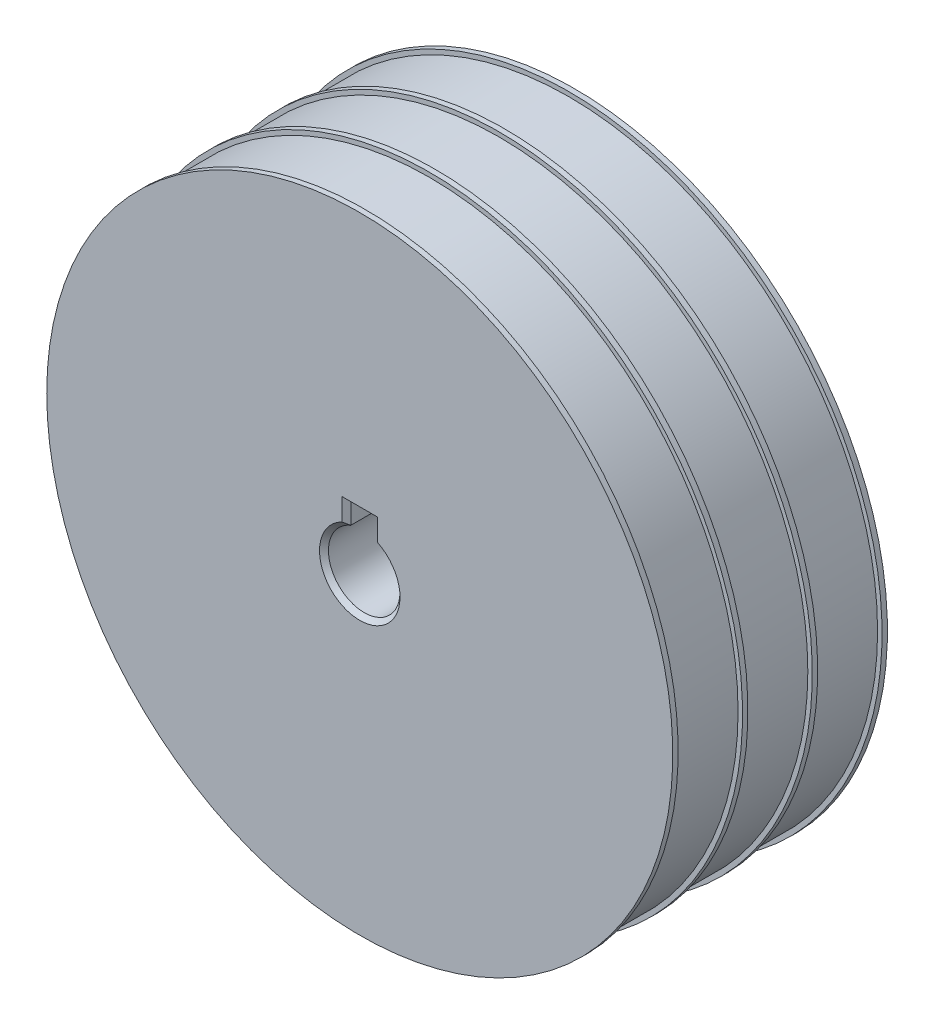
ISO-10303-21;
HEADER;
FILE_DESCRIPTION(('STEP AP214'),'2;1');
FILE_NAME('part.step','',(''),(''),'','','');
FILE_SCHEMA(('AUTOMOTIVE_DESIGN { 1 0 10303 214 1 1 1 1 }'));
ENDSEC;
DATA;
#1=APPLICATION_CONTEXT('core data for automotive mechanical design processes');
#2=APPLICATION_PROTOCOL_DEFINITION('international standard','automotive_design',2000,#1);
#3=PRODUCT_CONTEXT('',#1,'mechanical');
#4=PRODUCT('Part','Part','',(#3));
#5=PRODUCT_RELATED_PRODUCT_CATEGORY('part','',(#4));
#6=PRODUCT_DEFINITION_FORMATION('','',#4);
#7=PRODUCT_DEFINITION_CONTEXT('part definition',#1,'design');
#8=PRODUCT_DEFINITION('design','',#6,#7);
#9=PRODUCT_DEFINITION_SHAPE('','',#8);
#10=(LENGTH_UNIT() NAMED_UNIT(*) SI_UNIT(.MILLI.,.METRE.));
#11=(NAMED_UNIT(*) PLANE_ANGLE_UNIT() SI_UNIT($,.RADIAN.));
#12=(NAMED_UNIT(*) SI_UNIT($,.STERADIAN.) SOLID_ANGLE_UNIT());
#13=UNCERTAINTY_MEASURE_WITH_UNIT(LENGTH_MEASURE(1.E-05),#10,'distance_accuracy_value','');
#14=(GEOMETRIC_REPRESENTATION_CONTEXT(3) GLOBAL_UNCERTAINTY_ASSIGNED_CONTEXT((#13)) GLOBAL_UNIT_ASSIGNED_CONTEXT((#10,
#11,#12)) REPRESENTATION_CONTEXT('',''));
#15=CARTESIAN_POINT('',(0.,0.,0.));
#16=DIRECTION('',(0.,0.,1.));
#17=DIRECTION('',(1.,0.,0.));
#18=AXIS2_PLACEMENT_3D('',#15,#16,#17);
#19=CARTESIAN_POINT('',(0.,0.,-42.5522988505747));
#20=DIRECTION('',(0.,0.,-1.));
#21=DIRECTION('',(-1.,0.,0.));
#22=AXIS2_PLACEMENT_3D('',#19,#20,#21);
#23=CYLINDRICAL_SURFACE('',#22,4.);
#24=DIRECTION('',(0.,0.,-1.));
#25=VECTOR('',#24,1.);
#26=CARTESIAN_POINT('',(-1.5,3.70809924354783,-42.5522988505747));
#27=LINE('',#26,#25);
#28=CARTESIAN_POINT('',(-1.49999999999999,3.70809924354783,-2.39051724137928));
#29=VERTEX_POINT('',#28);
#30=CARTESIAN_POINT('',(-1.5,3.70809924354783,-25.3905172413793));
#31=VERTEX_POINT('',#30);
#32=EDGE_CURVE('E218',#29,#31,#27,.T.);
#33=ORIENTED_EDGE('',*,*,#32,.F.);
#34=CARTESIAN_POINT('',(0.,0.,-2.39051724137928));
#35=DIRECTION('',(0.,0.,1.));
#36=DIRECTION('',(1.,0.,0.));
#37=AXIS2_PLACEMENT_3D('',#34,#35,#36);
#38=CIRCLE('',#37,4.);
#39=CARTESIAN_POINT('',(1.50000000000001,3.70809924354783,-2.39051724137927));
#40=VERTEX_POINT('',#39);
#41=EDGE_CURVE('E108',#29,#40,#38,.T.);
#42=ORIENTED_EDGE('',*,*,#41,.T.);
#43=DIRECTION('',(0.,0.,-1.));
#44=VECTOR('',#43,1.);
#45=CARTESIAN_POINT('',(1.5,3.70809924354783,-42.5522988505747));
#46=LINE('',#45,#44);
#47=CARTESIAN_POINT('',(1.5,3.70809924354783,-25.3905172413793));
#48=VERTEX_POINT('',#47);
#49=EDGE_CURVE('E224',#48,#40,#46,.F.);
#50=ORIENTED_EDGE('',*,*,#49,.F.);
#51=CARTESIAN_POINT('',(0.,0.,-25.3905172413793));
#52=DIRECTION('',(0.,0.,-1.));
#53=DIRECTION('',(-1.,0.,0.));
#54=AXIS2_PLACEMENT_3D('',#51,#52,#53);
#55=CIRCLE('',#54,4.);
#56=EDGE_CURVE('E128',#48,#31,#55,.T.);
#57=ORIENTED_EDGE('',*,*,#56,.T.);
#58=EDGE_LOOP('',(#33,#42,#50,#57));
#59=FACE_BOUND('',#58,.T.);
#60=ADVANCED_FACE('F31',(#59),#23,.F.);
#61=CARTESIAN_POINT('',(-35.,0.,-1.89051724137929));
#62=DIRECTION('',(0.,0.,1.));
#63=DIRECTION('',(1.,0.,0.));
#64=AXIS2_PLACEMENT_3D('',#61,#62,#63);
#65=PLANE('',#64);
#66=DIRECTION('',(0.,-1.,0.));
#67=VECTOR('',#66,1.);
#68=CARTESIAN_POINT('',(2.,3.70809924354783,-1.89051724137929));
#69=LINE('',#68,#67);
#70=CARTESIAN_POINT('',(2.,6.5,-1.89051724137929));
#71=VERTEX_POINT('',#70);
#72=CARTESIAN_POINT('',(2.,4.03112887414939,-1.89051724137929));
#73=VERTEX_POINT('',#72);
#74=EDGE_CURVE('E126',#71,#73,#69,.T.);
#75=ORIENTED_EDGE('',*,*,#74,.T.);
#76=CARTESIAN_POINT('',(0.,0.,-1.89051724137929));
#77=DIRECTION('',(0.,0.,1.));
#78=DIRECTION('',(1.,0.,0.));
#79=AXIS2_PLACEMENT_3D('',#76,#77,#78);
#80=CIRCLE('',#79,4.5);
#81=CARTESIAN_POINT('',(-1.99999999999999,4.03112887414939,-1.89051724137929));
#82=VERTEX_POINT('',#81);
#83=EDGE_CURVE('E106',#73,#82,#80,.F.);
#84=ORIENTED_EDGE('',*,*,#83,.T.);
#85=DIRECTION('',(0.,1.,0.));
#86=VECTOR('',#85,1.);
#87=CARTESIAN_POINT('',(-1.99999999999999,6.,-1.89051724137929));
#88=LINE('',#87,#86);
#89=CARTESIAN_POINT('',(-1.99999999999999,6.5,-1.89051724137929));
#90=VERTEX_POINT('',#89);
#91=EDGE_CURVE('E114',#82,#90,#88,.T.);
#92=ORIENTED_EDGE('',*,*,#91,.T.);
#93=DIRECTION('',(1.,0.,0.));
#94=VECTOR('',#93,1.);
#95=CARTESIAN_POINT('',(1.50000000000001,6.5,-1.89051724137929));
#96=LINE('',#95,#94);
#97=EDGE_CURVE('E120',#90,#71,#96,.T.);
#98=ORIENTED_EDGE('',*,*,#97,.T.);
#99=EDGE_LOOP('',(#75,#84,#92,#98));
#100=FACE_BOUND('',#99,.T.);
#101=CARTESIAN_POINT('',(0.,0.,-1.89051724137929));
#102=DIRECTION('',(0.,0.,-1.));
#103=DIRECTION('',(-1.,0.,0.));
#104=AXIS2_PLACEMENT_3D('',#101,#102,#103);
#105=CIRCLE('',#104,35.);
#106=CARTESIAN_POINT('',(-35.,0.,-1.89051724137929));
#107=VERTEX_POINT('',#106);
#108=EDGE_CURVE('E121',#107,#107,#105,.T.);
#109=ORIENTED_EDGE('',*,*,#108,.F.);
#110=EDGE_LOOP('',(#109));
#111=FACE_BOUND('',#110,.T.);
#112=ADVANCED_FACE('F123',(#100,#111),#65,.T.);
#113=CARTESIAN_POINT('',(0.,0.,-42.5522988505747));
#114=DIRECTION('',(0.,0.,-1.));
#115=DIRECTION('',(-1.,0.,0.));
#116=AXIS2_PLACEMENT_3D('',#113,#114,#115);
#117=CYLINDRICAL_SURFACE('',#116,35.);
#118=ORIENTED_EDGE('',*,*,#108,.T.);
#119=EDGE_LOOP('',(#118));
#120=FACE_BOUND('',#119,.T.);
#121=CARTESIAN_POINT('',(0.,0.,-2.4905172413793));
#122=DIRECTION('',(0.,0.,-1.));
#123=DIRECTION('',(-1.,0.,0.));
#124=AXIS2_PLACEMENT_3D('',#121,#122,#123);
#125=CIRCLE('',#124,35.);
#126=CARTESIAN_POINT('',(-35.,0.,-2.49051724137929));
#127=VERTEX_POINT('',#126);
#128=EDGE_CURVE('E257',#127,#127,#125,.T.);
#129=ORIENTED_EDGE('',*,*,#128,.F.);
#130=EDGE_LOOP('',(#129));
#131=FACE_BOUND('',#130,.T.);
#132=ADVANCED_FACE('F293',(#120,#131),#117,.T.);
#133=CARTESIAN_POINT('',(-34.5,0.,-2.49051724137929));
#134=DIRECTION('',(0.,0.,-1.));
#135=DIRECTION('',(-1.,0.,0.));
#136=AXIS2_PLACEMENT_3D('',#133,#134,#135);
#137=PLANE('',#136);
#138=ORIENTED_EDGE('',*,*,#128,.T.);
#139=EDGE_LOOP('',(#138));
#140=FACE_BOUND('',#139,.T.);
#141=CARTESIAN_POINT('',(0.,0.,-2.4905172413793));
#142=DIRECTION('',(0.,0.,-1.));
#143=DIRECTION('',(-1.,0.,0.));
#144=AXIS2_PLACEMENT_3D('',#141,#142,#143);
#145=CIRCLE('',#144,34.5);
#146=CARTESIAN_POINT('',(-34.5,0.,-2.49051724137929));
#147=VERTEX_POINT('',#146);
#148=EDGE_CURVE('E254',#147,#147,#145,.T.);
#149=ORIENTED_EDGE('',*,*,#148,.F.);
#150=EDGE_LOOP('',(#149));
#151=FACE_BOUND('',#150,.T.);
#152=ADVANCED_FACE('F298',(#140,#151),#137,.T.);
#153=CARTESIAN_POINT('',(0.,0.,-42.5522988505747));
#154=DIRECTION('',(0.,0.,-1.));
#155=DIRECTION('',(-1.,0.,0.));
#156=AXIS2_PLACEMENT_3D('',#153,#154,#155);
#157=CYLINDRICAL_SURFACE('',#156,34.5);
#158=ORIENTED_EDGE('',*,*,#148,.T.);
#159=EDGE_LOOP('',(#158));
#160=FACE_BOUND('',#159,.T.);
#161=CARTESIAN_POINT('',(0.,0.,-9.6905172413793));
#162=DIRECTION('',(0.,0.,-1.));
#163=DIRECTION('',(-1.,0.,0.));
#164=AXIS2_PLACEMENT_3D('',#161,#162,#163);
#165=CIRCLE('',#164,34.5);
#166=CARTESIAN_POINT('',(-34.5,0.,-9.69051724137929));
#167=VERTEX_POINT('',#166);
#168=EDGE_CURVE('E251',#167,#167,#165,.T.);
#169=ORIENTED_EDGE('',*,*,#168,.F.);
#170=EDGE_LOOP('',(#169));
#171=FACE_BOUND('',#170,.T.);
#172=ADVANCED_FACE('F302',(#160,#171),#157,.T.);
#173=CARTESIAN_POINT('',(-35.,0.,-9.69051724137929));
#174=DIRECTION('',(0.,0.,1.));
#175=DIRECTION('',(1.,0.,0.));
#176=AXIS2_PLACEMENT_3D('',#173,#174,#175);
#177=PLANE('',#176);
#178=ORIENTED_EDGE('',*,*,#168,.T.);
#179=EDGE_LOOP('',(#178));
#180=FACE_BOUND('',#179,.T.);
#181=CARTESIAN_POINT('',(0.,0.,-9.6905172413793));
#182=DIRECTION('',(0.,0.,-1.));
#183=DIRECTION('',(-1.,0.,0.));
#184=AXIS2_PLACEMENT_3D('',#181,#182,#183);
#185=CIRCLE('',#184,35.);
#186=CARTESIAN_POINT('',(-35.,0.,-9.69051724137929));
#187=VERTEX_POINT('',#186);
#188=EDGE_CURVE('E248',#187,#187,#185,.T.);
#189=ORIENTED_EDGE('',*,*,#188,.F.);
#190=EDGE_LOOP('',(#189));
#191=FACE_BOUND('',#190,.T.);
#192=ADVANCED_FACE('F306',(#180,#191),#177,.T.);
#193=CARTESIAN_POINT('',(0.,0.,-42.5522988505747));
#194=DIRECTION('',(0.,0.,-1.));
#195=DIRECTION('',(-1.,0.,0.));
#196=AXIS2_PLACEMENT_3D('',#193,#194,#195);
#197=CYLINDRICAL_SURFACE('',#196,35.);
#198=ORIENTED_EDGE('',*,*,#188,.T.);
#199=EDGE_LOOP('',(#198));
#200=FACE_BOUND('',#199,.T.);
#201=CARTESIAN_POINT('',(0.,0.,-10.2905172413793));
#202=DIRECTION('',(0.,0.,-1.));
#203=DIRECTION('',(-1.,0.,0.));
#204=AXIS2_PLACEMENT_3D('',#201,#202,#203);
#205=CIRCLE('',#204,35.);
#206=CARTESIAN_POINT('',(-35.,0.,-10.2905172413793));
#207=VERTEX_POINT('',#206);
#208=EDGE_CURVE('E245',#207,#207,#205,.T.);
#209=ORIENTED_EDGE('',*,*,#208,.F.);
#210=EDGE_LOOP('',(#209));
#211=FACE_BOUND('',#210,.T.);
#212=ADVANCED_FACE('F310',(#200,#211),#197,.T.);
#213=CARTESIAN_POINT('',(-34.5,0.,-10.2905172413793));
#214=DIRECTION('',(0.,0.,-1.));
#215=DIRECTION('',(-1.,0.,0.));
#216=AXIS2_PLACEMENT_3D('',#213,#214,#215);
#217=PLANE('',#216);
#218=ORIENTED_EDGE('',*,*,#208,.T.);
#219=EDGE_LOOP('',(#218));
#220=FACE_BOUND('',#219,.T.);
#221=CARTESIAN_POINT('',(0.,0.,-10.2905172413793));
#222=DIRECTION('',(0.,0.,-1.));
#223=DIRECTION('',(-1.,0.,0.));
#224=AXIS2_PLACEMENT_3D('',#221,#222,#223);
#225=CIRCLE('',#224,34.5);
#226=CARTESIAN_POINT('',(-34.5,0.,-10.2905172413793));
#227=VERTEX_POINT('',#226);
#228=EDGE_CURVE('E242',#227,#227,#225,.T.);
#229=ORIENTED_EDGE('',*,*,#228,.F.);
#230=EDGE_LOOP('',(#229));
#231=FACE_BOUND('',#230,.T.);
#232=ADVANCED_FACE('F314',(#220,#231),#217,.T.);
#233=CARTESIAN_POINT('',(0.,0.,-42.5522988505747));
#234=DIRECTION('',(0.,0.,-1.));
#235=DIRECTION('',(-1.,0.,0.));
#236=AXIS2_PLACEMENT_3D('',#233,#234,#235);
#237=CYLINDRICAL_SURFACE('',#236,34.5);
#238=ORIENTED_EDGE('',*,*,#228,.T.);
#239=EDGE_LOOP('',(#238));
#240=FACE_BOUND('',#239,.T.);
#241=CARTESIAN_POINT('',(0.,0.,-17.4905172413793));
#242=DIRECTION('',(0.,0.,-1.));
#243=DIRECTION('',(-1.,0.,0.));
#244=AXIS2_PLACEMENT_3D('',#241,#242,#243);
#245=CIRCLE('',#244,34.5);
#246=CARTESIAN_POINT('',(-34.5,0.,-17.4905172413793));
#247=VERTEX_POINT('',#246);
#248=EDGE_CURVE('E239',#247,#247,#245,.T.);
#249=ORIENTED_EDGE('',*,*,#248,.F.);
#250=EDGE_LOOP('',(#249));
#251=FACE_BOUND('',#250,.T.);
#252=ADVANCED_FACE('F318',(#240,#251),#237,.T.);
#253=CARTESIAN_POINT('',(-35.,0.,-17.4905172413793));
#254=DIRECTION('',(0.,0.,1.));
#255=DIRECTION('',(1.,0.,0.));
#256=AXIS2_PLACEMENT_3D('',#253,#254,#255);
#257=PLANE('',#256);
#258=ORIENTED_EDGE('',*,*,#248,.T.);
#259=EDGE_LOOP('',(#258));
#260=FACE_BOUND('',#259,.T.);
#261=CARTESIAN_POINT('',(0.,0.,-17.4905172413793));
#262=DIRECTION('',(0.,0.,-1.));
#263=DIRECTION('',(-1.,0.,0.));
#264=AXIS2_PLACEMENT_3D('',#261,#262,#263);
#265=CIRCLE('',#264,35.);
#266=CARTESIAN_POINT('',(-35.,0.,-17.4905172413793));
#267=VERTEX_POINT('',#266);
#268=EDGE_CURVE('E236',#267,#267,#265,.T.);
#269=ORIENTED_EDGE('',*,*,#268,.F.);
#270=EDGE_LOOP('',(#269));
#271=FACE_BOUND('',#270,.T.);
#272=ADVANCED_FACE('F322',(#260,#271),#257,.T.);
#273=CARTESIAN_POINT('',(0.,0.,-42.5522988505747));
#274=DIRECTION('',(0.,0.,-1.));
#275=DIRECTION('',(-1.,0.,0.));
#276=AXIS2_PLACEMENT_3D('',#273,#274,#275);
#277=CYLINDRICAL_SURFACE('',#276,35.);
#278=ORIENTED_EDGE('',*,*,#268,.T.);
#279=EDGE_LOOP('',(#278));
#280=FACE_BOUND('',#279,.T.);
#281=CARTESIAN_POINT('',(0.,0.,-18.0905172413793));
#282=DIRECTION('',(0.,0.,-1.));
#283=DIRECTION('',(-1.,0.,0.));
#284=AXIS2_PLACEMENT_3D('',#281,#282,#283);
#285=CIRCLE('',#284,35.);
#286=CARTESIAN_POINT('',(-35.,0.,-18.0905172413793));
#287=VERTEX_POINT('',#286);
#288=EDGE_CURVE('E233',#287,#287,#285,.T.);
#289=ORIENTED_EDGE('',*,*,#288,.F.);
#290=EDGE_LOOP('',(#289));
#291=FACE_BOUND('',#290,.T.);
#292=ADVANCED_FACE('F326',(#280,#291),#277,.T.);
#293=CARTESIAN_POINT('',(-34.5,0.,-18.0905172413793));
#294=DIRECTION('',(0.,0.,-1.));
#295=DIRECTION('',(-1.,0.,0.));
#296=AXIS2_PLACEMENT_3D('',#293,#294,#295);
#297=PLANE('',#296);
#298=ORIENTED_EDGE('',*,*,#288,.T.);
#299=EDGE_LOOP('',(#298));
#300=FACE_BOUND('',#299,.T.);
#301=CARTESIAN_POINT('',(0.,0.,-18.0905172413793));
#302=DIRECTION('',(0.,0.,-1.));
#303=DIRECTION('',(-1.,0.,0.));
#304=AXIS2_PLACEMENT_3D('',#301,#302,#303);
#305=CIRCLE('',#304,34.5);
#306=CARTESIAN_POINT('',(-34.5,0.,-18.0905172413793));
#307=VERTEX_POINT('',#306);
#308=EDGE_CURVE('E230',#307,#307,#305,.T.);
#309=ORIENTED_EDGE('',*,*,#308,.F.);
#310=EDGE_LOOP('',(#309));
#311=FACE_BOUND('',#310,.T.);
#312=ADVANCED_FACE('F330',(#300,#311),#297,.T.);
#313=CARTESIAN_POINT('',(0.,0.,-42.5522988505747));
#314=DIRECTION('',(0.,0.,-1.));
#315=DIRECTION('',(-1.,0.,0.));
#316=AXIS2_PLACEMENT_3D('',#313,#314,#315);
#317=CYLINDRICAL_SURFACE('',#316,34.5);
#318=ORIENTED_EDGE('',*,*,#308,.T.);
#319=EDGE_LOOP('',(#318));
#320=FACE_BOUND('',#319,.T.);
#321=CARTESIAN_POINT('',(0.,0.,-25.2905172413793));
#322=DIRECTION('',(0.,0.,-1.));
#323=DIRECTION('',(-1.,0.,0.));
#324=AXIS2_PLACEMENT_3D('',#321,#322,#323);
#325=CIRCLE('',#324,34.5);
#326=CARTESIAN_POINT('',(-34.5,0.,-25.2905172413793));
#327=VERTEX_POINT('',#326);
#328=EDGE_CURVE('E221',#327,#327,#325,.T.);
#329=ORIENTED_EDGE('',*,*,#328,.F.);
#330=EDGE_LOOP('',(#329));
#331=FACE_BOUND('',#330,.T.);
#332=ADVANCED_FACE('F334',(#320,#331),#317,.T.);
#333=CARTESIAN_POINT('',(-35.,0.,-25.2905172413793));
#334=DIRECTION('',(0.,0.,1.));
#335=DIRECTION('',(1.,0.,0.));
#336=AXIS2_PLACEMENT_3D('',#333,#334,#335);
#337=PLANE('',#336);
#338=ORIENTED_EDGE('',*,*,#328,.T.);
#339=EDGE_LOOP('',(#338));
#340=FACE_BOUND('',#339,.T.);
#341=CARTESIAN_POINT('',(0.,0.,-25.2905172413793));
#342=DIRECTION('',(0.,0.,-1.));
#343=DIRECTION('',(-1.,0.,0.));
#344=AXIS2_PLACEMENT_3D('',#341,#342,#343);
#345=CIRCLE('',#344,35.);
#346=CARTESIAN_POINT('',(-35.,0.,-25.2905172413793));
#347=VERTEX_POINT('',#346);
#348=EDGE_CURVE('E217',#347,#347,#345,.T.);
#349=ORIENTED_EDGE('',*,*,#348,.F.);
#350=EDGE_LOOP('',(#349));
#351=FACE_BOUND('',#350,.T.);
#352=ADVANCED_FACE('F338',(#340,#351),#337,.T.);
#353=CARTESIAN_POINT('',(0.,0.,-42.5522988505747));
#354=DIRECTION('',(0.,0.,-1.));
#355=DIRECTION('',(-1.,0.,0.));
#356=AXIS2_PLACEMENT_3D('',#353,#354,#355);
#357=CYLINDRICAL_SURFACE('',#356,35.);
#358=ORIENTED_EDGE('',*,*,#348,.T.);
#359=EDGE_LOOP('',(#358));
#360=FACE_BOUND('',#359,.T.);
#361=CARTESIAN_POINT('',(0.,0.,-25.8905172413793));
#362=DIRECTION('',(0.,0.,-1.));
#363=DIRECTION('',(-1.,0.,0.));
#364=AXIS2_PLACEMENT_3D('',#361,#362,#363);
#365=CIRCLE('',#364,35.);
#366=CARTESIAN_POINT('',(-35.,0.,-25.8905172413793));
#367=VERTEX_POINT('',#366);
#368=EDGE_CURVE('E215',#367,#367,#365,.T.);
#369=ORIENTED_EDGE('',*,*,#368,.F.);
#370=EDGE_LOOP('',(#369));
#371=FACE_BOUND('',#370,.T.);
#372=ADVANCED_FACE('F211',(#360,#371),#357,.T.);
#373=CARTESIAN_POINT('',(-3.99999999999999,0.,-25.8905172413793));
#374=DIRECTION('',(0.,0.,-1.));
#375=DIRECTION('',(-1.,0.,0.));
#376=AXIS2_PLACEMENT_3D('',#373,#374,#375);
#377=PLANE('',#376);
#378=DIRECTION('',(-1.,0.,0.));
#379=VECTOR('',#378,1.);
#380=CARTESIAN_POINT('',(-1.5,6.49999999999999,-25.8905172413793));
#381=LINE('',#380,#379);
#382=CARTESIAN_POINT('',(1.99999999999999,6.49999999999999,-25.8905172413793));
#383=VERTEX_POINT('',#382);
#384=CARTESIAN_POINT('',(-1.99999999999999,6.49999999999999,-25.8905172413793));
#385=VERTEX_POINT('',#384);
#386=EDGE_CURVE('E45',#383,#385,#381,.T.);
#387=ORIENTED_EDGE('',*,*,#386,.T.);
#388=DIRECTION('',(0.,-1.,0.));
#389=VECTOR('',#388,1.);
#390=CARTESIAN_POINT('',(-1.99999999999999,3.70809924354783,-25.8905172413793));
#391=LINE('',#390,#389);
#392=CARTESIAN_POINT('',(-1.99999999999976,4.03112887414938,-25.8905172413793));
#393=VERTEX_POINT('',#392);
#394=EDGE_CURVE('E11',#385,#393,#391,.T.);
#395=ORIENTED_EDGE('',*,*,#394,.T.);
#396=CARTESIAN_POINT('',(0.,0.,-25.8905172413793));
#397=DIRECTION('',(0.,0.,-1.));
#398=DIRECTION('',(-1.,0.,0.));
#399=AXIS2_PLACEMENT_3D('',#396,#397,#398);
#400=CIRCLE('',#399,4.49999999999999);
#401=CARTESIAN_POINT('',(1.99999999999977,4.03112887414938,-25.8905172413793));
#402=VERTEX_POINT('',#401);
#403=EDGE_CURVE('E148',#393,#402,#400,.F.);
#404=ORIENTED_EDGE('',*,*,#403,.T.);
#405=DIRECTION('',(0.,1.,0.));
#406=VECTOR('',#405,1.);
#407=CARTESIAN_POINT('',(1.99999999999999,6.,-25.8905172413793));
#408=LINE('',#407,#406);
#409=EDGE_CURVE('E56',#402,#383,#408,.T.);
#410=ORIENTED_EDGE('',*,*,#409,.T.);
#411=EDGE_LOOP('',(#387,#395,#404,#410));
#412=FACE_BOUND('',#411,.T.);
#413=ORIENTED_EDGE('',*,*,#368,.T.);
#414=EDGE_LOOP('',(#413));
#415=FACE_BOUND('',#414,.T.);
#416=ADVANCED_FACE('F207',(#412,#415),#377,.T.);
#417=CARTESIAN_POINT('',(-1.49999999999999,6.,-1.89051724137929));
#418=DIRECTION('',(-1.,0.,0.));
#419=DIRECTION('',(0.,0.,1.));
#420=AXIS2_PLACEMENT_3D('',#417,#418,#419);
#421=PLANE('',#420);
#422=DIRECTION('',(0.,0.,-1.));
#423=VECTOR('',#422,1.);
#424=CARTESIAN_POINT('',(-1.49999999999999,6.,-1.89051724137929));
#425=LINE('',#424,#423);
#426=CARTESIAN_POINT('',(-1.49999999999999,6.,-2.39051724137928));
#427=VERTEX_POINT('',#426);
#428=CARTESIAN_POINT('',(-1.5,6.,-25.3905172413793));
#429=VERTEX_POINT('',#428);
#430=EDGE_CURVE('E266',#427,#429,#425,.T.);
#431=ORIENTED_EDGE('',*,*,#430,.F.);
#432=DIRECTION('',(0.,-1.,0.));
#433=VECTOR('',#432,1.);
#434=CARTESIAN_POINT('',(-1.49999999999999,3.70809924354783,-2.39051724137928));
#435=LINE('',#434,#433);
#436=EDGE_CURVE('E146',#427,#29,#435,.T.);
#437=ORIENTED_EDGE('',*,*,#436,.T.);
#438=ORIENTED_EDGE('',*,*,#32,.T.);
#439=DIRECTION('',(0.,1.,0.));
#440=VECTOR('',#439,1.);
#441=CARTESIAN_POINT('',(-1.5,6.,-25.3905172413793));
#442=LINE('',#441,#440);
#443=EDGE_CURVE('E143',#31,#429,#442,.T.);
#444=ORIENTED_EDGE('',*,*,#443,.T.);
#445=EDGE_LOOP('',(#431,#437,#438,#444));
#446=FACE_BOUND('',#445,.T.);
#447=ADVANCED_FACE('F210',(#446),#421,.F.);
#448=CARTESIAN_POINT('',(1.50000000000001,6.,-1.89051724137929));
#449=DIRECTION('',(1.,0.,0.));
#450=DIRECTION('',(0.,0.,-1.));
#451=AXIS2_PLACEMENT_3D('',#448,#449,#450);
#452=PLANE('',#451);
#453=ORIENTED_EDGE('',*,*,#49,.T.);
#454=DIRECTION('',(0.,1.,0.));
#455=VECTOR('',#454,1.);
#456=CARTESIAN_POINT('',(1.50000000000001,6.,-2.39051724137928));
#457=LINE('',#456,#455);
#458=CARTESIAN_POINT('',(1.50000000000001,6.,-2.39051724137928));
#459=VERTEX_POINT('',#458);
#460=EDGE_CURVE('E137',#40,#459,#457,.T.);
#461=ORIENTED_EDGE('',*,*,#460,.T.);
#462=DIRECTION('',(0.,0.,-1.));
#463=VECTOR('',#462,1.);
#464=CARTESIAN_POINT('',(1.50000000000001,6.,-1.89051724137929));
#465=LINE('',#464,#463);
#466=CARTESIAN_POINT('',(1.5,6.,-25.3905172413793));
#467=VERTEX_POINT('',#466);
#468=EDGE_CURVE('E275',#459,#467,#465,.T.);
#469=ORIENTED_EDGE('',*,*,#468,.T.);
#470=DIRECTION('',(0.,-1.,0.));
#471=VECTOR('',#470,1.);
#472=CARTESIAN_POINT('',(1.5,3.70809924354783,-25.3905172413793));
#473=LINE('',#472,#471);
#474=EDGE_CURVE('E135',#467,#48,#473,.T.);
#475=ORIENTED_EDGE('',*,*,#474,.T.);
#476=EDGE_LOOP('',(#453,#461,#469,#475));
#477=FACE_BOUND('',#476,.T.);
#478=ADVANCED_FACE('F274',(#477),#452,.F.);
#479=CARTESIAN_POINT('',(1.50000000000001,6.,-1.89051724137929));
#480=DIRECTION('',(0.,1.,0.));
#481=DIRECTION('',(0.,0.,1.));
#482=AXIS2_PLACEMENT_3D('',#479,#480,#481);
#483=PLANE('',#482);
#484=ORIENTED_EDGE('',*,*,#468,.F.);
#485=DIRECTION('',(-1.,0.,0.));
#486=VECTOR('',#485,1.);
#487=CARTESIAN_POINT('',(-1.49999999999999,6.,-2.39051724137928));
#488=LINE('',#487,#486);
#489=EDGE_CURVE('E141',#459,#427,#488,.T.);
#490=ORIENTED_EDGE('',*,*,#489,.T.);
#491=ORIENTED_EDGE('',*,*,#430,.T.);
#492=DIRECTION('',(1.,0.,0.));
#493=VECTOR('',#492,1.);
#494=CARTESIAN_POINT('',(1.5,6.,-25.3905172413793));
#495=LINE('',#494,#493);
#496=EDGE_CURVE('E139',#429,#467,#495,.T.);
#497=ORIENTED_EDGE('',*,*,#496,.T.);
#498=EDGE_LOOP('',(#484,#490,#491,#497));
#499=FACE_BOUND('',#498,.T.);
#500=ADVANCED_FACE('F174',(#499),#483,.F.);
#501=CARTESIAN_POINT('',(-35.,6.5,-1.89051724137929));
#502=DIRECTION('',(0.,-0.707106781186537,0.707106781186557));
#503=DIRECTION('',(0.,-0.707106781186558,-0.707106781186538));
#504=AXIS2_PLACEMENT_3D('',#501,#502,#503);
#505=PLANE('',#504);
#506=DIRECTION('',(-0.577350269189631,0.577350269189631,0.577350269189615));
#507=VECTOR('',#506,1.);
#508=CARTESIAN_POINT('',(-13.0000000000002,17.5000000000002,9.1094827586206));
#509=LINE('',#508,#507);
#510=EDGE_CURVE('E117',#427,#90,#509,.T.);
#511=ORIENTED_EDGE('',*,*,#510,.F.);
#512=ORIENTED_EDGE('',*,*,#489,.F.);
#513=DIRECTION('',(0.577350269189628,0.577350269189633,0.577350269189616));
#514=VECTOR('',#513,1.);
#515=CARTESIAN_POINT('',(-0.1666666666667,4.33333333333328,-4.05718390804595));
#516=LINE('',#515,#514);
#517=EDGE_CURVE('E264',#71,#459,#516,.F.);
#518=ORIENTED_EDGE('',*,*,#517,.F.);
#519=ORIENTED_EDGE('',*,*,#97,.F.);
#520=EDGE_LOOP('',(#511,#512,#518,#519));
#521=FACE_BOUND('',#520,.T.);
#522=ADVANCED_FACE('F171',(#521),#505,.T.);
#523=CARTESIAN_POINT('',(2.,0.,-1.89051724137929));
#524=DIRECTION('',(-0.70710678118654,0.,0.707106781186555));
#525=DIRECTION('',(0.707106781186555,0.,0.70710678118654));
#526=AXIS2_PLACEMENT_3D('',#523,#524,#525);
#527=PLANE('',#526);
#528=ORIENTED_EDGE('',*,*,#517,.T.);
#529=ORIENTED_EDGE('',*,*,#460,.F.);
#530=CARTESIAN_POINT('',(1.50000000000001,3.70809924354783,-2.39051724137927));
#531=CARTESIAN_POINT('',(1.54135353594812,3.7359793372648,-2.34916370543116));
#532=CARTESIAN_POINT('',(1.5827930282711,3.76360385741972,-2.30772421310819));
#533=CARTESIAN_POINT('',(1.6658301977337,3.81836371456104,-2.22468704364559));
#534=CARTESIAN_POINT('',(1.70742786487303,3.84549908187039,-2.18308937650626));
#535=CARTESIAN_POINT('',(1.790772431521,3.8993058197357,-2.09974480985829));
#536=CARTESIAN_POINT('',(1.83251932969376,3.92597719443275,-2.05799791168553));
#537=CARTESIAN_POINT('',(1.91615573962413,3.97887895199151,-1.97436150175516));
#538=CARTESIAN_POINT('',(1.95804526009092,4.00510930731993,-1.93247198128837));
#539=CARTESIAN_POINT('',(1.99999999999994,4.03112887414924,-1.89051724137935));
#540=B_SPLINE_CURVE_WITH_KNOTS('',3,(#530,#531,#532,#533,#534,#535,#536,#537,#538,#539),
.UNSPECIFIED.,.F.,.F.,(4,2,2,2,4),(0.,0.194364052592499,0.388716014694266,0.583066241335679,
0.77742855674827),.UNSPECIFIED.);
#541=EDGE_CURVE('E111',#73,#40,#540,.F.);
#542=ORIENTED_EDGE('',*,*,#541,.F.);
#543=ORIENTED_EDGE('',*,*,#74,.F.);
#544=EDGE_LOOP('',(#528,#529,#542,#543));
#545=FACE_BOUND('',#544,.T.);
#546=ADVANCED_FACE('F166',(#545),#527,.T.);
#547=CARTESIAN_POINT('',(-1.99999999999999,0.,-1.89051724137929));
#548=DIRECTION('',(0.707106781186538,0.,0.707106781186557));
#549=DIRECTION('',(0.707106781186557,0.,-0.707106781186538));
#550=AXIS2_PLACEMENT_3D('',#547,#548,#549);
#551=PLANE('',#550);
#552=ORIENTED_EDGE('',*,*,#510,.T.);
#553=ORIENTED_EDGE('',*,*,#91,.F.);
#554=CARTESIAN_POINT('',(-1.99999999999977,4.03112887414939,-1.89051724137929));
#555=CARTESIAN_POINT('',(-1.95804526009085,4.00510930731999,-1.93247198128835));
#556=CARTESIAN_POINT('',(-1.91615573962411,3.97887895199153,-1.97436150175516));
#557=CARTESIAN_POINT('',(-1.83251932969377,3.92597719443273,-2.05799791168554));
#558=CARTESIAN_POINT('',(-1.79077243152099,3.8993058197357,-2.09974480985829));
#559=CARTESIAN_POINT('',(-1.70742786487301,3.8454990818704,-2.18308937650626));
#560=CARTESIAN_POINT('',(-1.66583019773369,3.81836371456104,-2.22468704364559));
#561=CARTESIAN_POINT('',(-1.58279302827109,3.76360385741971,-2.30772421310819));
#562=CARTESIAN_POINT('',(-1.54135353594811,3.7359793372648,-2.34916370543117));
#563=CARTESIAN_POINT('',(-1.49999999999999,3.70809924354783,-2.39051724137928));
#564=B_SPLINE_CURVE_WITH_KNOTS('',3,(#554,#555,#556,#557,#558,#559,#560,#561,#562,#563),
.UNSPECIFIED.,.F.,.F.,(4,2,2,2,4),(0.,0.194362315412589,0.388712542054002,0.58306450415577,
0.777428556748269),.UNSPECIFIED.);
#565=EDGE_CURVE('E102',#29,#82,#564,.F.);
#566=ORIENTED_EDGE('',*,*,#565,.F.);
#567=ORIENTED_EDGE('',*,*,#436,.F.);
#568=EDGE_LOOP('',(#552,#553,#566,#567));
#569=FACE_BOUND('',#568,.T.);
#570=ADVANCED_FACE('F115',(#569),#551,.T.);
#571=CARTESIAN_POINT('',(0.,0.,-1.89051724137929));
#572=DIRECTION('',(0.,0.,1.));
#573=DIRECTION('',(1.,0.,0.));
#574=AXIS2_PLACEMENT_3D('',#571,#572,#573);
#575=CONICAL_SURFACE('',#574,4.5,0.785398163397462);
#576=ORIENTED_EDGE('',*,*,#541,.T.);
#577=ORIENTED_EDGE('',*,*,#41,.F.);
#578=ORIENTED_EDGE('',*,*,#565,.T.);
#579=ORIENTED_EDGE('',*,*,#83,.F.);
#580=EDGE_LOOP('',(#576,#577,#578,#579));
#581=FACE_BOUND('',#580,.T.);
#582=ADVANCED_FACE('F104',(#581),#575,.F.);
#583=CARTESIAN_POINT('',(1.5,6.,-25.3905172413793));
#584=DIRECTION('',(-0.707106781186536,0.,-0.707106781186559));
#585=DIRECTION('',(-0.707106781186559,0.,0.707106781186536));
#586=AXIS2_PLACEMENT_3D('',#583,#584,#585);
#587=PLANE('',#586);
#588=DIRECTION('',(0.577350269189632,0.577350269189631,-0.577350269189614));
#589=VECTOR('',#588,1.);
#590=CARTESIAN_POINT('',(1.5,6.,-25.3905172413793));
#591=LINE('',#590,#589);
#592=EDGE_CURVE('E191',#383,#467,#591,.F.);
#593=ORIENTED_EDGE('',*,*,#592,.F.);
#594=ORIENTED_EDGE('',*,*,#409,.F.);
#595=CARTESIAN_POINT('',(1.5,3.70809924354783,-25.3905172413793));
#596=CARTESIAN_POINT('',(1.54135353594813,3.73597933726481,-25.4318707773274));
#597=CARTESIAN_POINT('',(1.58279302827113,3.76360385741974,-25.4733102696504));
#598=CARTESIAN_POINT('',(1.66583019773377,3.81836371456109,-25.5563474391131));
#599=CARTESIAN_POINT('',(1.70742786487311,3.84549908187045,-25.5979451062524));
#600=CARTESIAN_POINT('',(1.79077243152112,3.89930581973578,-25.6812896729004));
#601=CARTESIAN_POINT('',(1.8325193296939,3.92597719443283,-25.7230365710732));
#602=CARTESIAN_POINT('',(1.91615573962431,3.97887895199162,-25.8066729810036));
#603=CARTESIAN_POINT('',(1.95804526009112,4.00510930732005,-25.8485625014704));
#604=CARTESIAN_POINT('',(2.00000000000015,4.03112887414937,-25.8905172413795));
#605=B_SPLINE_CURVE_WITH_KNOTS('',3,(#595,#596,#597,#598,#599,#600,#601,#602,#603,#604),
.UNSPECIFIED.,.F.,.F.,(4,2,2,2,4),(0.,0.194364052592583,0.388716014694433,0.583066241335931,
0.777428556748603),.UNSPECIFIED.);
#606=EDGE_CURVE('E36',#48,#402,#605,.T.);
#607=ORIENTED_EDGE('',*,*,#606,.F.);
#608=ORIENTED_EDGE('',*,*,#474,.F.);
#609=EDGE_LOOP('',(#593,#594,#607,#608));
#610=FACE_BOUND('',#609,.T.);
#611=ADVANCED_FACE('F33',(#610),#587,.T.);
#612=CARTESIAN_POINT('',(0.,0.,-25.3905172413793));
#613=DIRECTION('',(0.,0.,-1.));
#614=DIRECTION('',(-1.,0.,0.));
#615=AXIS2_PLACEMENT_3D('',#612,#613,#614);
#616=CONICAL_SURFACE('',#615,4.,0.785398163397464);
#617=ORIENTED_EDGE('',*,*,#606,.T.);
#618=ORIENTED_EDGE('',*,*,#403,.F.);
#619=CARTESIAN_POINT('',(-1.99999999999999,4.03112887414984,-25.8905172413793));
#620=CARTESIAN_POINT('',(-1.95804526009105,4.00510930732022,-25.8485625014704));
#621=CARTESIAN_POINT('',(-1.91615573962428,3.97887895199166,-25.8066729810036));
#622=CARTESIAN_POINT('',(-1.83251932969391,3.92597719443278,-25.7230365710732));
#623=CARTESIAN_POINT('',(-1.79077243152112,3.89930581973576,-25.6812896729004));
#624=CARTESIAN_POINT('',(-1.7074278648731,3.84549908187046,-25.5979451062524));
#625=CARTESIAN_POINT('',(-1.66583019773376,3.81836371456109,-25.5563474391131));
#626=CARTESIAN_POINT('',(-1.58279302827112,3.76360385741973,-25.4733102696504));
#627=CARTESIAN_POINT('',(-1.54135353594813,3.7359793372648,-25.4318707773275));
#628=CARTESIAN_POINT('',(-1.5,3.70809924354783,-25.3905172413793));
#629=B_SPLINE_CURVE_WITH_KNOTS('',3,(#619,#620,#621,#622,#623,#624,#625,#626,#627,#628),
.UNSPECIFIED.,.F.,.F.,(4,2,2,2,4),(0.,0.194362315412665,0.38871254205416,0.583064504156008,
0.777428556748587),.UNSPECIFIED.);
#630=EDGE_CURVE('E186',#31,#393,#629,.F.);
#631=ORIENTED_EDGE('',*,*,#630,.F.);
#632=ORIENTED_EDGE('',*,*,#56,.F.);
#633=EDGE_LOOP('',(#617,#618,#631,#632));
#634=FACE_BOUND('',#633,.T.);
#635=ADVANCED_FACE('F176',(#634),#616,.F.);
#636=CARTESIAN_POINT('',(1.5,6.,-25.3905172413793));
#637=DIRECTION('',(0.,-0.707106781186537,-0.707106781186558));
#638=DIRECTION('',(0.,0.707106781186558,-0.707106781186537));
#639=AXIS2_PLACEMENT_3D('',#636,#637,#638);
#640=PLANE('',#639);
#641=ORIENTED_EDGE('',*,*,#592,.T.);
#642=ORIENTED_EDGE('',*,*,#496,.F.);
#643=DIRECTION('',(-0.577350269189632,0.577350269189631,-0.577350269189614));
#644=VECTOR('',#643,1.);
#645=CARTESIAN_POINT('',(-1.5,6.,-25.3905172413793));
#646=LINE('',#645,#644);
#647=EDGE_CURVE('E192',#385,#429,#646,.F.);
#648=ORIENTED_EDGE('',*,*,#647,.F.);
#649=ORIENTED_EDGE('',*,*,#386,.F.);
#650=EDGE_LOOP('',(#641,#642,#648,#649));
#651=FACE_BOUND('',#650,.T.);
#652=ADVANCED_FACE('F180',(#651),#640,.T.);
#653=CARTESIAN_POINT('',(-1.5,6.,-25.3905172413793));
#654=DIRECTION('',(0.707106781186536,0.,-0.707106781186559));
#655=DIRECTION('',(-0.707106781186559,0.,-0.707106781186536));
#656=AXIS2_PLACEMENT_3D('',#653,#654,#655);
#657=PLANE('',#656);
#658=ORIENTED_EDGE('',*,*,#630,.T.);
#659=ORIENTED_EDGE('',*,*,#394,.F.);
#660=ORIENTED_EDGE('',*,*,#647,.T.);
#661=ORIENTED_EDGE('',*,*,#443,.F.);
#662=EDGE_LOOP('',(#658,#659,#660,#661));
#663=FACE_BOUND('',#662,.T.);
#664=ADVANCED_FACE('F182',(#663),#657,.T.);
#665=CLOSED_SHELL('',(#60,#112,#132,#152,#172,#192,#212,#232,#252,#272,#292,#312,#332,#352,#372,
#416,#447,#478,#500,#522,#546,#570,#582,#611,#635,#652,#664));
#666=MANIFOLD_SOLID_BREP('B2',#665);
#667=ADVANCED_BREP_SHAPE_REPRESENTATION('',(#18,#666),#14);
#668=SHAPE_DEFINITION_REPRESENTATION(#9,#667);
ENDSEC;
END-ISO-10303-21;
